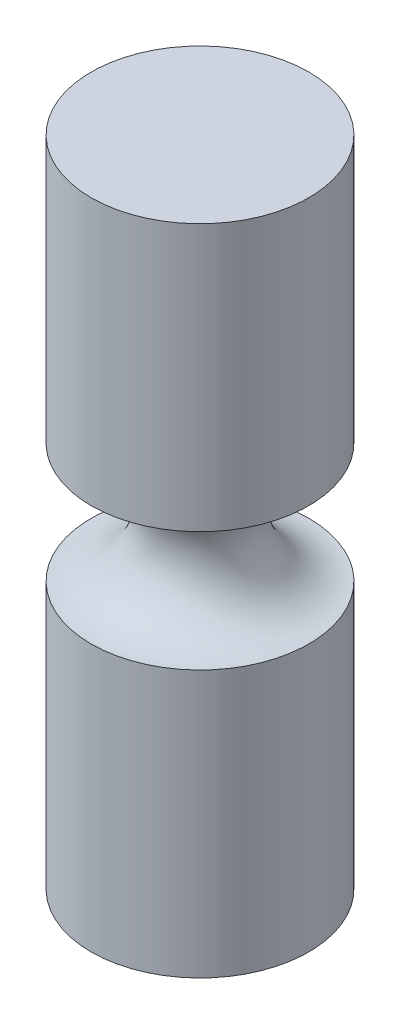
ISO-10303-21;
HEADER;
FILE_DESCRIPTION(('STEP AP214'),'2;1');
FILE_NAME('part.step','',(''),(''),'','','');
FILE_SCHEMA(('AUTOMOTIVE_DESIGN { 1 0 10303 214 1 1 1 1 }'));
ENDSEC;
DATA;
#1=APPLICATION_CONTEXT('core data for automotive mechanical design processes');
#2=APPLICATION_PROTOCOL_DEFINITION('international standard','automotive_design',2000,#1);
#3=PRODUCT_CONTEXT('',#1,'mechanical');
#4=PRODUCT('Part','Part','',(#3));
#5=PRODUCT_RELATED_PRODUCT_CATEGORY('part','',(#4));
#6=PRODUCT_DEFINITION_FORMATION('','',#4);
#7=PRODUCT_DEFINITION_CONTEXT('part definition',#1,'design');
#8=PRODUCT_DEFINITION('design','',#6,#7);
#9=PRODUCT_DEFINITION_SHAPE('','',#8);
#10=(LENGTH_UNIT() NAMED_UNIT(*) SI_UNIT(.MILLI.,.METRE.));
#11=(NAMED_UNIT(*) PLANE_ANGLE_UNIT() SI_UNIT($,.RADIAN.));
#12=(NAMED_UNIT(*) SI_UNIT($,.STERADIAN.) SOLID_ANGLE_UNIT());
#13=UNCERTAINTY_MEASURE_WITH_UNIT(LENGTH_MEASURE(1.E-05),#10,'distance_accuracy_value','');
#14=(GEOMETRIC_REPRESENTATION_CONTEXT(3) GLOBAL_UNCERTAINTY_ASSIGNED_CONTEXT((#13)) GLOBAL_UNIT_ASSIGNED_CONTEXT((#10,
#11,#12)) REPRESENTATION_CONTEXT('',''));
#15=CARTESIAN_POINT('',(0.,0.,0.));
#16=DIRECTION('',(0.,0.,1.));
#17=DIRECTION('',(1.,0.,0.));
#18=AXIS2_PLACEMENT_3D('',#15,#16,#17);
#19=CARTESIAN_POINT('',(0.,30.,0.));
#20=DIRECTION('',(0.,-1.,0.));
#21=DIRECTION('',(0.,0.,-1.));
#22=AXIS2_PLACEMENT_3D('',#19,#20,#21);
#23=CYLINDRICAL_SURFACE('',#22,10.);
#24=CARTESIAN_POINT('',(0.,24.5,0.));
#25=DIRECTION('',(0.,1.,0.));
#26=DIRECTION('',(0.,0.,1.));
#27=AXIS2_PLACEMENT_3D('',#24,#25,#26);
#28=CIRCLE('',#27,10.);
#29=CARTESIAN_POINT('',(0.,24.5,10.));
#30=VERTEX_POINT('',#29);
#31=EDGE_CURVE('E57',#30,#30,#28,.F.);
#32=ORIENTED_EDGE('',*,*,#31,.T.);
#33=EDGE_LOOP('',(#32));
#34=FACE_BOUND('',#33,.T.);
#35=CARTESIAN_POINT('',(0.,0.,0.));
#36=DIRECTION('',(0.,1.,0.));
#37=DIRECTION('',(0.,0.,1.));
#38=AXIS2_PLACEMENT_3D('',#35,#36,#37);
#39=CIRCLE('',#38,10.);
#40=CARTESIAN_POINT('',(0.,0.,10.));
#41=VERTEX_POINT('',#40);
#42=EDGE_CURVE('E11',#41,#41,#39,.T.);
#43=ORIENTED_EDGE('',*,*,#42,.T.);
#44=EDGE_LOOP('',(#43));
#45=FACE_BOUND('',#44,.T.);
#46=ADVANCED_FACE('F49',(#34,#45),#23,.T.);
#47=CARTESIAN_POINT('',(0.,0.,0.));
#48=DIRECTION('',(0.,1.,0.));
#49=DIRECTION('',(0.,0.,1.));
#50=AXIS2_PLACEMENT_3D('',#47,#48,#49);
#51=PLANE('',#50);
#52=ORIENTED_EDGE('',*,*,#42,.F.);
#53=EDGE_LOOP('',(#52));
#54=FACE_BOUND('',#53,.T.);
#55=ADVANCED_FACE('F92',(#54),#51,.F.);
#56=CARTESIAN_POINT('',(0.,30.,0.));
#57=DIRECTION('',(0.,1.,0.));
#58=DIRECTION('',(0.,0.,1.));
#59=AXIS2_PLACEMENT_3D('',#56,#57,#58);
#60=TOROIDAL_SURFACE('',#59,10.,5.5);
#61=CARTESIAN_POINT('',(0.,30.,10.));
#62=DIRECTION('',(1.,0.,0.));
#63=DIRECTION('',(0.,0.,-1.));
#64=AXIS2_PLACEMENT_3D('',#61,#62,#63);
#65=CIRCLE('',#64,5.5);
#66=CARTESIAN_POINT('',(0.,35.5,10.));
#67=VERTEX_POINT('',#66);
#68=EDGE_CURVE('E64',#30,#67,#65,.T.);
#69=ORIENTED_EDGE('',*,*,#68,.T.);
#70=CARTESIAN_POINT('',(0.,35.5,0.));
#71=DIRECTION('',(0.,1.,0.));
#72=DIRECTION('',(0.,0.,1.));
#73=AXIS2_PLACEMENT_3D('',#70,#71,#72);
#74=CIRCLE('',#73,10.);
#75=EDGE_CURVE('E67',#67,#67,#74,.F.);
#76=ORIENTED_EDGE('',*,*,#75,.T.);
#77=ORIENTED_EDGE('',*,*,#68,.F.);
#78=ORIENTED_EDGE('',*,*,#31,.F.);
#79=EDGE_LOOP('',(#69,#76,#77,#78));
#80=FACE_BOUND('',#79,.T.);
#81=ADVANCED_FACE('F65',(#80),#60,.F.);
#82=CARTESIAN_POINT('',(0.,30.,0.));
#83=DIRECTION('',(0.,1.,0.));
#84=DIRECTION('',(0.,0.,-1.));
#85=AXIS2_PLACEMENT_3D('',#82,#83,#84);
#86=CYLINDRICAL_SURFACE('',#85,10.);
#87=ORIENTED_EDGE('',*,*,#75,.F.);
#88=EDGE_LOOP('',(#87));
#89=FACE_BOUND('',#88,.T.);
#90=CARTESIAN_POINT('',(0.,60.,0.));
#91=DIRECTION('',(0.,1.,0.));
#92=DIRECTION('',(0.,0.,1.));
#93=AXIS2_PLACEMENT_3D('',#90,#91,#92);
#94=CIRCLE('',#93,10.);
#95=CARTESIAN_POINT('',(0.,60.,10.));
#96=VERTEX_POINT('',#95);
#97=EDGE_CURVE('E70',#96,#96,#94,.T.);
#98=ORIENTED_EDGE('',*,*,#97,.F.);
#99=EDGE_LOOP('',(#98));
#100=FACE_BOUND('',#99,.T.);
#101=ADVANCED_FACE('F82',(#89,#100),#86,.T.);
#102=CARTESIAN_POINT('',(0.,60.,0.));
#103=DIRECTION('',(0.,-1.,0.));
#104=DIRECTION('',(0.,0.,1.));
#105=AXIS2_PLACEMENT_3D('',#102,#103,#104);
#106=PLANE('',#105);
#107=ORIENTED_EDGE('',*,*,#97,.T.);
#108=EDGE_LOOP('',(#107));
#109=FACE_BOUND('',#108,.T.);
#110=ADVANCED_FACE('F80',(#109),#106,.F.);
#111=CLOSED_SHELL('',(#46,#55,#81,#101,#110));
#112=MANIFOLD_SOLID_BREP('B2',#111);
#113=ADVANCED_BREP_SHAPE_REPRESENTATION('',(#18,#112),#14);
#114=SHAPE_DEFINITION_REPRESENTATION(#9,#113);
ENDSEC;
END-ISO-10303-21;
